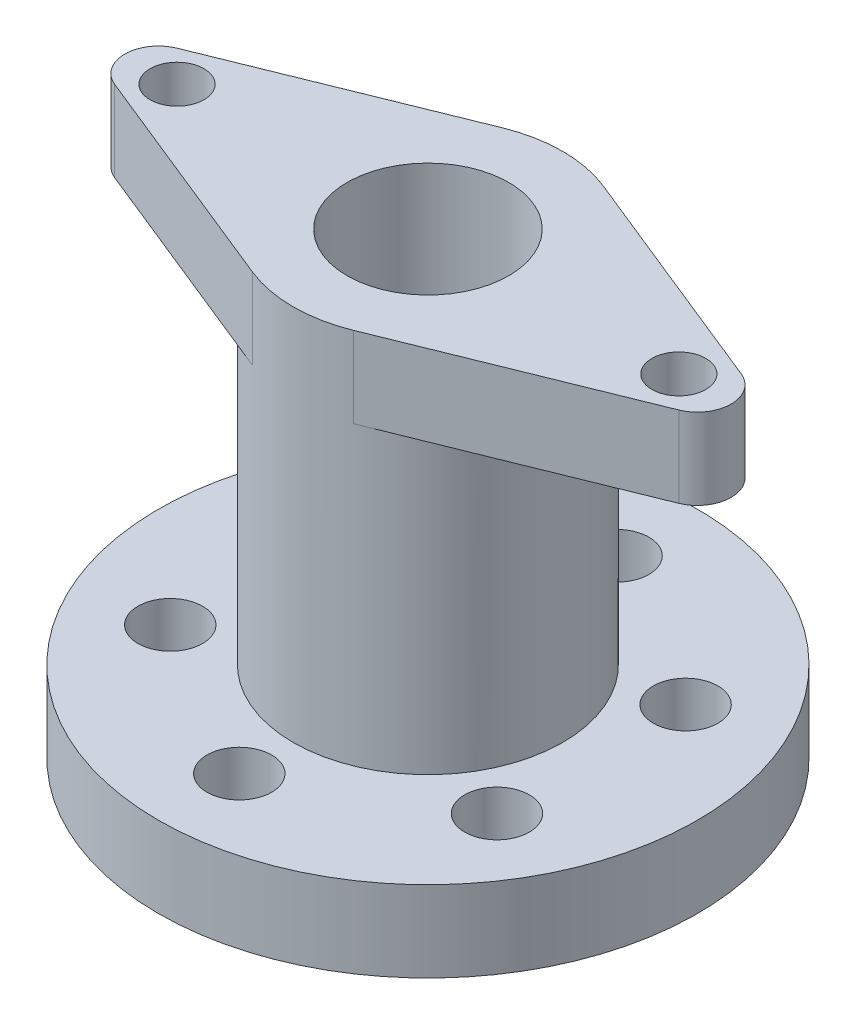
ISO-10303-21;
HEADER;
FILE_DESCRIPTION(('STEP AP214'),'2;1');
FILE_NAME('part.step','',(''),(''),'','','');
FILE_SCHEMA(('AUTOMOTIVE_DESIGN { 1 0 10303 214 1 1 1 1 }'));
ENDSEC;
DATA;
#1=APPLICATION_CONTEXT('core data for automotive mechanical design processes');
#2=APPLICATION_PROTOCOL_DEFINITION('international standard','automotive_design',2000,#1);
#3=PRODUCT_CONTEXT('',#1,'mechanical');
#4=PRODUCT('Part','Part','',(#3));
#5=PRODUCT_RELATED_PRODUCT_CATEGORY('part','',(#4));
#6=PRODUCT_DEFINITION_FORMATION('','',#4);
#7=PRODUCT_DEFINITION_CONTEXT('part definition',#1,'design');
#8=PRODUCT_DEFINITION('design','',#6,#7);
#9=PRODUCT_DEFINITION_SHAPE('','',#8);
#10=(LENGTH_UNIT() NAMED_UNIT(*) SI_UNIT(.MILLI.,.METRE.));
#11=(NAMED_UNIT(*) PLANE_ANGLE_UNIT() SI_UNIT($,.RADIAN.));
#12=(NAMED_UNIT(*) SI_UNIT($,.STERADIAN.) SOLID_ANGLE_UNIT());
#13=UNCERTAINTY_MEASURE_WITH_UNIT(LENGTH_MEASURE(1.E-05),#10,'distance_accuracy_value','');
#14=(GEOMETRIC_REPRESENTATION_CONTEXT(3) GLOBAL_UNCERTAINTY_ASSIGNED_CONTEXT((#13)) GLOBAL_UNIT_ASSIGNED_CONTEXT((#10,
#11,#12)) REPRESENTATION_CONTEXT('',''));
#15=CARTESIAN_POINT('',(0.,0.,0.));
#16=DIRECTION('',(0.,0.,1.));
#17=DIRECTION('',(1.,0.,0.));
#18=AXIS2_PLACEMENT_3D('',#15,#16,#17);
#19=CARTESIAN_POINT('',(-303.108891324531,150.,175.000000000013));
#20=DIRECTION('',(0.,-1.,0.));
#21=DIRECTION('',(0.,0.,-1.));
#22=AXIS2_PLACEMENT_3D('',#19,#20,#21);
#23=CYLINDRICAL_SURFACE('',#22,60.0000000000283);
#24=CARTESIAN_POINT('',(-303.108891324531,150.,175.000000000013));
#25=DIRECTION('',(0.,1.,0.));
#26=DIRECTION('',(0.,0.,1.));
#27=AXIS2_PLACEMENT_3D('',#24,#25,#26);
#28=CIRCLE('',#27,60.0000000000283);
#29=CARTESIAN_POINT('',(-303.108891324531,150.,235.000000000041));
#30=VERTEX_POINT('',#29);
#31=EDGE_CURVE('E208',#30,#30,#28,.T.);
#32=ORIENTED_EDGE('',*,*,#31,.T.);
#33=EDGE_LOOP('',(#32));
#34=FACE_BOUND('',#33,.T.);
#35=CARTESIAN_POINT('',(-303.108891324531,0.,175.000000000013));
#36=DIRECTION('',(0.,1.,0.));
#37=DIRECTION('',(0.,0.,1.));
#38=AXIS2_PLACEMENT_3D('',#35,#36,#37);
#39=CIRCLE('',#38,60.0000000000283);
#40=CARTESIAN_POINT('',(-303.108891324531,0.,235.000000000041));
#41=VERTEX_POINT('',#40);
#42=EDGE_CURVE('E226',#41,#41,#39,.T.);
#43=ORIENTED_EDGE('',*,*,#42,.F.);
#44=EDGE_LOOP('',(#43));
#45=FACE_BOUND('',#44,.T.);
#46=ADVANCED_FACE('F39',(#34,#45),#23,.F.);
#47=CARTESIAN_POINT('',(2.97142069880137E-11,150.,350.));
#48=DIRECTION('',(0.,-1.,0.));
#49=DIRECTION('',(0.,0.,-1.));
#50=AXIS2_PLACEMENT_3D('',#47,#48,#49);
#51=CYLINDRICAL_SURFACE('',#50,60.0000000000308);
#52=CARTESIAN_POINT('',(2.97142069880137E-11,150.,350.));
#53=DIRECTION('',(0.,1.,0.));
#54=DIRECTION('',(0.,0.,1.));
#55=AXIS2_PLACEMENT_3D('',#52,#53,#54);
#56=CIRCLE('',#55,60.0000000000308);
#57=CARTESIAN_POINT('',(2.97142069880137E-11,150.,410.000000000031));
#58=VERTEX_POINT('',#57);
#59=EDGE_CURVE('E205',#58,#58,#56,.T.);
#60=ORIENTED_EDGE('',*,*,#59,.T.);
#61=EDGE_LOOP('',(#60));
#62=FACE_BOUND('',#61,.T.);
#63=CARTESIAN_POINT('',(2.97142069880137E-11,0.,350.));
#64=DIRECTION('',(0.,1.,0.));
#65=DIRECTION('',(0.,0.,1.));
#66=AXIS2_PLACEMENT_3D('',#63,#64,#65);
#67=CIRCLE('',#66,60.0000000000308);
#68=CARTESIAN_POINT('',(2.97142069880137E-11,0.,410.000000000031));
#69=VERTEX_POINT('',#68);
#70=EDGE_CURVE('E224',#69,#69,#67,.T.);
#71=ORIENTED_EDGE('',*,*,#70,.F.);
#72=EDGE_LOOP('',(#71));
#73=FACE_BOUND('',#72,.T.);
#74=ADVANCED_FACE('F254',(#62,#73),#51,.F.);
#75=CARTESIAN_POINT('',(303.108891324576,150.,174.999999999987));
#76=DIRECTION('',(0.,-1.,0.));
#77=DIRECTION('',(0.,0.,-1.));
#78=AXIS2_PLACEMENT_3D('',#75,#76,#77);
#79=CYLINDRICAL_SURFACE('',#78,60.0000000000191);
#80=CARTESIAN_POINT('',(303.108891324576,150.,174.999999999987));
#81=DIRECTION('',(0.,1.,0.));
#82=DIRECTION('',(0.,0.,1.));
#83=AXIS2_PLACEMENT_3D('',#80,#81,#82);
#84=CIRCLE('',#83,60.0000000000191);
#85=CARTESIAN_POINT('',(303.108891324576,150.,235.000000000006));
#86=VERTEX_POINT('',#85);
#87=EDGE_CURVE('E202',#86,#86,#84,.T.);
#88=ORIENTED_EDGE('',*,*,#87,.T.);
#89=EDGE_LOOP('',(#88));
#90=FACE_BOUND('',#89,.T.);
#91=CARTESIAN_POINT('',(303.108891324576,0.,174.999999999987));
#92=DIRECTION('',(0.,1.,0.));
#93=DIRECTION('',(0.,0.,1.));
#94=AXIS2_PLACEMENT_3D('',#91,#92,#93);
#95=CIRCLE('',#94,60.0000000000191);
#96=CARTESIAN_POINT('',(303.108891324576,0.,235.000000000006));
#97=VERTEX_POINT('',#96);
#98=EDGE_CURVE('E221',#97,#97,#95,.T.);
#99=ORIENTED_EDGE('',*,*,#98,.F.);
#100=EDGE_LOOP('',(#99));
#101=FACE_BOUND('',#100,.T.);
#102=ADVANCED_FACE('F260',(#90,#101),#79,.F.);
#103=CARTESIAN_POINT('',(303.108891324561,150.,-175.000000000013));
#104=DIRECTION('',(0.,-1.,0.));
#105=DIRECTION('',(0.,0.,-1.));
#106=AXIS2_PLACEMENT_3D('',#103,#104,#105);
#107=CYLINDRICAL_SURFACE('',#106,60.0000000000042);
#108=CARTESIAN_POINT('',(303.108891324561,150.,-175.000000000013));
#109=DIRECTION('',(0.,1.,0.));
#110=DIRECTION('',(0.,0.,1.));
#111=AXIS2_PLACEMENT_3D('',#108,#109,#110);
#112=CIRCLE('',#111,60.0000000000042);
#113=CARTESIAN_POINT('',(303.108891324561,150.,-115.000000000009));
#114=VERTEX_POINT('',#113);
#115=EDGE_CURVE('E199',#114,#114,#112,.T.);
#116=ORIENTED_EDGE('',*,*,#115,.T.);
#117=EDGE_LOOP('',(#116));
#118=FACE_BOUND('',#117,.T.);
#119=CARTESIAN_POINT('',(303.108891324561,0.,-175.000000000013));
#120=DIRECTION('',(0.,1.,0.));
#121=DIRECTION('',(0.,0.,1.));
#122=AXIS2_PLACEMENT_3D('',#119,#120,#121);
#123=CIRCLE('',#122,60.0000000000042);
#124=CARTESIAN_POINT('',(303.108891324561,0.,-115.000000000009));
#125=VERTEX_POINT('',#124);
#126=EDGE_CURVE('E218',#125,#125,#123,.T.);
#127=ORIENTED_EDGE('',*,*,#126,.F.);
#128=EDGE_LOOP('',(#127));
#129=FACE_BOUND('',#128,.T.);
#130=ADVANCED_FACE('F267',(#118,#129),#107,.F.);
#131=CARTESIAN_POINT('',(0.,150.,-350.));
#132=DIRECTION('',(0.,-1.,0.));
#133=DIRECTION('',(0.,0.,-1.));
#134=AXIS2_PLACEMENT_3D('',#131,#132,#133);
#135=CYLINDRICAL_SURFACE('',#134,60.);
#136=CARTESIAN_POINT('',(0.,150.,-350.));
#137=DIRECTION('',(0.,1.,0.));
#138=DIRECTION('',(0.,0.,1.));
#139=AXIS2_PLACEMENT_3D('',#136,#137,#138);
#140=CIRCLE('',#139,60.);
#141=CARTESIAN_POINT('',(0.,150.,-290.));
#142=VERTEX_POINT('',#141);
#143=EDGE_CURVE('E196',#142,#142,#140,.T.);
#144=ORIENTED_EDGE('',*,*,#143,.T.);
#145=EDGE_LOOP('',(#144));
#146=FACE_BOUND('',#145,.T.);
#147=CARTESIAN_POINT('',(0.,0.,-350.));
#148=DIRECTION('',(0.,1.,0.));
#149=DIRECTION('',(0.,0.,1.));
#150=AXIS2_PLACEMENT_3D('',#147,#148,#149);
#151=CIRCLE('',#150,60.);
#152=CARTESIAN_POINT('',(0.,0.,-290.));
#153=VERTEX_POINT('',#152);
#154=EDGE_CURVE('E215',#153,#153,#151,.T.);
#155=ORIENTED_EDGE('',*,*,#154,.F.);
#156=EDGE_LOOP('',(#155));
#157=FACE_BOUND('',#156,.T.);
#158=ADVANCED_FACE('F270',(#146,#157),#135,.F.);
#159=CARTESIAN_POINT('',(-303.108891324546,150.,-174.999999999987));
#160=DIRECTION('',(0.,-1.,0.));
#161=DIRECTION('',(0.,0.,-1.));
#162=AXIS2_PLACEMENT_3D('',#159,#160,#161);
#163=CYLINDRICAL_SURFACE('',#162,60.000000000015);
#164=CARTESIAN_POINT('',(-303.108891324546,150.,-174.999999999987));
#165=DIRECTION('',(0.,1.,0.));
#166=DIRECTION('',(0.,0.,1.));
#167=AXIS2_PLACEMENT_3D('',#164,#165,#166);
#168=CIRCLE('',#167,60.000000000015);
#169=CARTESIAN_POINT('',(-303.108891324546,150.,-114.999999999972));
#170=VERTEX_POINT('',#169);
#171=EDGE_CURVE('E193',#170,#170,#168,.T.);
#172=ORIENTED_EDGE('',*,*,#171,.T.);
#173=EDGE_LOOP('',(#172));
#174=FACE_BOUND('',#173,.T.);
#175=CARTESIAN_POINT('',(-303.108891324546,0.,-174.999999999987));
#176=DIRECTION('',(0.,1.,0.));
#177=DIRECTION('',(0.,0.,1.));
#178=AXIS2_PLACEMENT_3D('',#175,#176,#177);
#179=CIRCLE('',#178,60.000000000015);
#180=CARTESIAN_POINT('',(-303.108891324546,0.,-114.999999999972));
#181=VERTEX_POINT('',#180);
#182=EDGE_CURVE('E192',#181,#181,#179,.T.);
#183=ORIENTED_EDGE('',*,*,#182,.F.);
#184=EDGE_LOOP('',(#183));
#185=FACE_BOUND('',#184,.T.);
#186=ADVANCED_FACE('F41',(#174,#185),#163,.F.);
#187=CARTESIAN_POINT('',(0.,150.,0.));
#188=DIRECTION('',(0.,-1.,0.));
#189=DIRECTION('',(0.,0.,-1.));
#190=AXIS2_PLACEMENT_3D('',#187,#188,#189);
#191=CYLINDRICAL_SURFACE('',#190,500.);
#192=CARTESIAN_POINT('',(0.,150.,0.));
#193=DIRECTION('',(0.,1.,0.));
#194=DIRECTION('',(0.,0.,1.));
#195=AXIS2_PLACEMENT_3D('',#192,#193,#194);
#196=CIRCLE('',#195,500.);
#197=CARTESIAN_POINT('',(0.,150.,500.));
#198=VERTEX_POINT('',#197);
#199=EDGE_CURVE('E48',#198,#198,#196,.T.);
#200=ORIENTED_EDGE('',*,*,#199,.F.);
#201=EDGE_LOOP('',(#200));
#202=FACE_BOUND('',#201,.T.);
#203=CARTESIAN_POINT('',(0.,0.,0.));
#204=DIRECTION('',(0.,1.,0.));
#205=DIRECTION('',(0.,0.,1.));
#206=AXIS2_PLACEMENT_3D('',#203,#204,#205);
#207=CIRCLE('',#206,500.);
#208=CARTESIAN_POINT('',(0.,0.,500.));
#209=VERTEX_POINT('',#208);
#210=EDGE_CURVE('E43',#209,#209,#207,.T.);
#211=ORIENTED_EDGE('',*,*,#210,.T.);
#212=EDGE_LOOP('',(#211));
#213=FACE_BOUND('',#212,.T.);
#214=ADVANCED_FACE('F233',(#202,#213),#191,.T.);
#215=CARTESIAN_POINT('',(0.,150.,0.));
#216=DIRECTION('',(0.,1.,0.));
#217=DIRECTION('',(0.,0.,1.));
#218=AXIS2_PLACEMENT_3D('',#215,#216,#217);
#219=PLANE('',#218);
#220=CARTESIAN_POINT('',(0.,150.,0.));
#221=DIRECTION('',(0.,1.,0.));
#222=DIRECTION('',(0.,0.,1.));
#223=AXIS2_PLACEMENT_3D('',#220,#221,#222);
#224=CIRCLE('',#223,250.);
#225=CARTESIAN_POINT('',(0.,150.,250.));
#226=VERTEX_POINT('',#225);
#227=EDGE_CURVE('E188',#226,#226,#224,.F.);
#228=ORIENTED_EDGE('',*,*,#227,.T.);
#229=EDGE_LOOP('',(#228));
#230=FACE_BOUND('',#229,.T.);
#231=ORIENTED_EDGE('',*,*,#171,.F.);
#232=EDGE_LOOP('',(#231));
#233=FACE_BOUND('',#232,.T.);
#234=ORIENTED_EDGE('',*,*,#143,.F.);
#235=EDGE_LOOP('',(#234));
#236=FACE_BOUND('',#235,.T.);
#237=ORIENTED_EDGE('',*,*,#115,.F.);
#238=EDGE_LOOP('',(#237));
#239=FACE_BOUND('',#238,.T.);
#240=ORIENTED_EDGE('',*,*,#87,.F.);
#241=EDGE_LOOP('',(#240));
#242=FACE_BOUND('',#241,.T.);
#243=ORIENTED_EDGE('',*,*,#59,.F.);
#244=EDGE_LOOP('',(#243));
#245=FACE_BOUND('',#244,.T.);
#246=ORIENTED_EDGE('',*,*,#31,.F.);
#247=EDGE_LOOP('',(#246));
#248=FACE_BOUND('',#247,.T.);
#249=ORIENTED_EDGE('',*,*,#199,.T.);
#250=EDGE_LOOP('',(#249));
#251=FACE_BOUND('',#250,.T.);
#252=ADVANCED_FACE('F238',(#230,#233,#236,#239,#242,#245,#248,#251),#219,.T.);
#253=CARTESIAN_POINT('',(0.,0.,0.));
#254=DIRECTION('',(0.,1.,0.));
#255=DIRECTION('',(0.,0.,1.));
#256=AXIS2_PLACEMENT_3D('',#253,#254,#255);
#257=PLANE('',#256);
#258=ORIENTED_EDGE('',*,*,#182,.T.);
#259=EDGE_LOOP('',(#258));
#260=FACE_BOUND('',#259,.T.);
#261=ORIENTED_EDGE('',*,*,#154,.T.);
#262=EDGE_LOOP('',(#261));
#263=FACE_BOUND('',#262,.T.);
#264=ORIENTED_EDGE('',*,*,#126,.T.);
#265=EDGE_LOOP('',(#264));
#266=FACE_BOUND('',#265,.T.);
#267=ORIENTED_EDGE('',*,*,#98,.T.);
#268=EDGE_LOOP('',(#267));
#269=FACE_BOUND('',#268,.T.);
#270=ORIENTED_EDGE('',*,*,#70,.T.);
#271=EDGE_LOOP('',(#270));
#272=FACE_BOUND('',#271,.T.);
#273=ORIENTED_EDGE('',*,*,#42,.T.);
#274=EDGE_LOOP('',(#273));
#275=FACE_BOUND('',#274,.T.);
#276=ORIENTED_EDGE('',*,*,#210,.F.);
#277=EDGE_LOOP('',(#276));
#278=FACE_BOUND('',#277,.T.);
#279=ADVANCED_FACE('F235',(#260,#263,#266,#269,#272,#275,#278),#257,.F.);
#280=CARTESIAN_POINT('',(0.,700.,0.));
#281=DIRECTION('',(0.,-1.,0.));
#282=DIRECTION('',(0.,0.,-1.));
#283=AXIS2_PLACEMENT_3D('',#280,#281,#282);
#284=CYLINDRICAL_SURFACE('',#283,250.);
#285=ORIENTED_EDGE('',*,*,#227,.F.);
#286=EDGE_LOOP('',(#285));
#287=FACE_BOUND('',#286,.T.);
#288=CARTESIAN_POINT('',(0.,700.,0.));
#289=DIRECTION('',(0.,1.,0.));
#290=DIRECTION('',(0.,0.,1.));
#291=AXIS2_PLACEMENT_3D('',#288,#289,#290);
#292=CIRCLE('',#291,250.);
#293=CARTESIAN_POINT('',(93.7500000000001,700.,231.75620272174));
#294=VERTEX_POINT('',#293);
#295=CARTESIAN_POINT('',(93.7500000000001,700.,-231.75620272174));
#296=VERTEX_POINT('',#295);
#297=EDGE_CURVE('E187',#294,#296,#292,.T.);
#298=ORIENTED_EDGE('',*,*,#297,.F.);
#299=DIRECTION('',(0.,-1.,0.));
#300=VECTOR('',#299,1.);
#301=CARTESIAN_POINT('',(93.7500000000001,850.,231.75620272174));
#302=LINE('',#301,#300);
#303=CARTESIAN_POINT('',(93.7500000000001,850.,231.75620272174));
#304=VERTEX_POINT('',#303);
#305=EDGE_CURVE('E181',#304,#294,#302,.T.);
#306=ORIENTED_EDGE('',*,*,#305,.F.);
#307=CARTESIAN_POINT('',(0.,850.,0.));
#308=DIRECTION('',(0.,1.,0.));
#309=DIRECTION('',(0.,0.,1.));
#310=AXIS2_PLACEMENT_3D('',#307,#308,#309);
#311=CIRCLE('',#310,250.);
#312=CARTESIAN_POINT('',(-93.7500000000001,850.,231.75620272174));
#313=VERTEX_POINT('',#312);
#314=EDGE_CURVE('E136',#313,#304,#311,.T.);
#315=ORIENTED_EDGE('',*,*,#314,.F.);
#316=DIRECTION('',(0.,-1.,0.));
#317=VECTOR('',#316,1.);
#318=CARTESIAN_POINT('',(-93.7500000000001,850.,231.75620272174));
#319=LINE('',#318,#317);
#320=CARTESIAN_POINT('',(-93.7500000000001,700.,231.75620272174));
#321=VERTEX_POINT('',#320);
#322=EDGE_CURVE('E184',#313,#321,#319,.T.);
#323=ORIENTED_EDGE('',*,*,#322,.T.);
#324=CARTESIAN_POINT('',(-93.7500000000001,700.,-231.75620272174));
#325=VERTEX_POINT('',#324);
#326=EDGE_CURVE('E56',#325,#321,#292,.T.);
#327=ORIENTED_EDGE('',*,*,#326,.F.);
#328=DIRECTION('',(0.,-1.,0.));
#329=VECTOR('',#328,1.);
#330=CARTESIAN_POINT('',(-93.7500000000001,850.,-231.756202721739));
#331=LINE('',#330,#329);
#332=CARTESIAN_POINT('',(-93.7500000000001,850.,-231.756202721739));
#333=VERTEX_POINT('',#332);
#334=EDGE_CURVE('E152',#333,#325,#331,.T.);
#335=ORIENTED_EDGE('',*,*,#334,.F.);
#336=CARTESIAN_POINT('',(93.7500000000001,850.,-231.756202721739));
#337=VERTEX_POINT('',#336);
#338=EDGE_CURVE('E128',#337,#333,#311,.T.);
#339=ORIENTED_EDGE('',*,*,#338,.F.);
#340=DIRECTION('',(0.,-1.,0.));
#341=VECTOR('',#340,1.);
#342=CARTESIAN_POINT('',(93.7500000000001,850.,-231.756202721739));
#343=LINE('',#342,#341);
#344=EDGE_CURVE('E174',#337,#296,#343,.T.);
#345=ORIENTED_EDGE('',*,*,#344,.T.);
#346=EDGE_LOOP('',(#298,#306,#315,#323,#327,#335,#339,#345));
#347=FACE_BOUND('',#346,.T.);
#348=ADVANCED_FACE('F237',(#287,#347),#284,.T.);
#349=CARTESIAN_POINT('',(0.,700.,0.));
#350=DIRECTION('',(0.,1.,0.));
#351=DIRECTION('',(0.,0.,1.));
#352=AXIS2_PLACEMENT_3D('',#349,#350,#351);
#353=PLANE('',#352);
#354=CARTESIAN_POINT('',(465.559791402256,700.,0.));
#355=DIRECTION('',(0.,1.,0.));
#356=DIRECTION('',(0.,0.,1.));
#357=AXIS2_PLACEMENT_3D('',#354,#355,#356);
#358=CIRCLE('',#357,50.);
#359=CARTESIAN_POINT('',(465.559791402256,700.,50.));
#360=VERTEX_POINT('',#359);
#361=EDGE_CURVE('E132',#360,#360,#358,.T.);
#362=ORIENTED_EDGE('',*,*,#361,.T.);
#363=EDGE_LOOP('',(#362));
#364=FACE_BOUND('',#363,.T.);
#365=DIRECTION('',(-0.927024810886958,0.,0.375));
#366=VECTOR('',#365,1.);
#367=CARTESIAN_POINT('',(93.7500000000001,700.,231.75620272174));
#368=LINE('',#367,#366);
#369=CARTESIAN_POINT('',(523.4375,700.,57.939050680435));
#370=VERTEX_POINT('',#369);
#371=EDGE_CURVE('E162',#370,#294,#368,.T.);
#372=ORIENTED_EDGE('',*,*,#371,.T.);
#373=ORIENTED_EDGE('',*,*,#297,.T.);
#374=DIRECTION('',(-0.927024810886958,0.,-0.375));
#375=VECTOR('',#374,1.);
#376=CARTESIAN_POINT('',(93.7500000000001,700.,-231.756202721739));
#377=LINE('',#376,#375);
#378=CARTESIAN_POINT('',(523.4375,700.,-57.9390506804347));
#379=VERTEX_POINT('',#378);
#380=EDGE_CURVE('E168',#379,#296,#377,.T.);
#381=ORIENTED_EDGE('',*,*,#380,.F.);
#382=CARTESIAN_POINT('',(500.,700.,0.));
#383=DIRECTION('',(0.,1.,0.));
#384=DIRECTION('',(0.,0.,1.));
#385=AXIS2_PLACEMENT_3D('',#382,#383,#384);
#386=CIRCLE('',#385,62.5);
#387=EDGE_CURVE('E165',#379,#370,#386,.F.);
#388=ORIENTED_EDGE('',*,*,#387,.T.);
#389=EDGE_LOOP('',(#372,#373,#381,#388));
#390=FACE_BOUND('',#389,.T.);
#391=ADVANCED_FACE('F245',(#364,#390),#353,.F.);
#392=CARTESIAN_POINT('',(-465.559791402256,700.,0.));
#393=DIRECTION('',(0.,1.,0.));
#394=DIRECTION('',(0.,0.,1.));
#395=AXIS2_PLACEMENT_3D('',#392,#393,#394);
#396=CIRCLE('',#395,50.);
#397=CARTESIAN_POINT('',(-465.559791402256,700.,50.));
#398=VERTEX_POINT('',#397);
#399=EDGE_CURVE('E153',#398,#398,#396,.T.);
#400=ORIENTED_EDGE('',*,*,#399,.T.);
#401=EDGE_LOOP('',(#400));
#402=FACE_BOUND('',#401,.T.);
#403=DIRECTION('',(0.927024810886958,0.,-0.375));
#404=VECTOR('',#403,1.);
#405=CARTESIAN_POINT('',(-93.7500000000001,700.,-231.756202721739));
#406=LINE('',#405,#404);
#407=CARTESIAN_POINT('',(-523.4375,700.,-57.9390506804347));
#408=VERTEX_POINT('',#407);
#409=EDGE_CURVE('E110',#408,#325,#406,.T.);
#410=ORIENTED_EDGE('',*,*,#409,.T.);
#411=ORIENTED_EDGE('',*,*,#326,.T.);
#412=DIRECTION('',(0.927024810886958,0.,0.375));
#413=VECTOR('',#412,1.);
#414=CARTESIAN_POINT('',(-93.7500000000001,700.,231.75620272174));
#415=LINE('',#414,#413);
#416=CARTESIAN_POINT('',(-523.4375,700.,57.939050680435));
#417=VERTEX_POINT('',#416);
#418=EDGE_CURVE('E159',#417,#321,#415,.T.);
#419=ORIENTED_EDGE('',*,*,#418,.F.);
#420=CARTESIAN_POINT('',(-500.,700.,0.));
#421=DIRECTION('',(0.,1.,0.));
#422=DIRECTION('',(0.,0.,1.));
#423=AXIS2_PLACEMENT_3D('',#420,#421,#422);
#424=CIRCLE('',#423,62.5);
#425=EDGE_CURVE('E157',#408,#417,#424,.T.);
#426=ORIENTED_EDGE('',*,*,#425,.F.);
#427=EDGE_LOOP('',(#410,#411,#419,#426));
#428=FACE_BOUND('',#427,.T.);
#429=ADVANCED_FACE('F347',(#402,#428),#353,.F.);
#430=CARTESIAN_POINT('',(-93.7500000000001,850.,-231.756202721739));
#431=DIRECTION('',(-0.375,0.,-0.927024810886958));
#432=DIRECTION('',(-0.927024810886958,0.,0.375));
#433=AXIS2_PLACEMENT_3D('',#430,#431,#432);
#434=PLANE('',#433);
#435=ORIENTED_EDGE('',*,*,#409,.F.);
#436=DIRECTION('',(0.,-1.,0.));
#437=VECTOR('',#436,1.);
#438=CARTESIAN_POINT('',(-523.4375,850.,-57.9390506804347));
#439=LINE('',#438,#437);
#440=CARTESIAN_POINT('',(-523.4375,850.,-57.9390506804347));
#441=VERTEX_POINT('',#440);
#442=EDGE_CURVE('E105',#441,#408,#439,.T.);
#443=ORIENTED_EDGE('',*,*,#442,.F.);
#444=DIRECTION('',(0.927024810886958,0.,-0.375));
#445=VECTOR('',#444,1.);
#446=CARTESIAN_POINT('',(-93.7500000000001,850.,-231.756202721739));
#447=LINE('',#446,#445);
#448=EDGE_CURVE('E109',#441,#333,#447,.T.);
#449=ORIENTED_EDGE('',*,*,#448,.T.);
#450=ORIENTED_EDGE('',*,*,#334,.T.);
#451=EDGE_LOOP('',(#435,#443,#449,#450));
#452=FACE_BOUND('',#451,.T.);
#453=ADVANCED_FACE('F107',(#452),#434,.T.);
#454=CARTESIAN_POINT('',(-500.,850.,0.));
#455=DIRECTION('',(0.,-1.,0.));
#456=DIRECTION('',(0.,0.,-1.));
#457=AXIS2_PLACEMENT_3D('',#454,#455,#456);
#458=CYLINDRICAL_SURFACE('',#457,62.5);
#459=ORIENTED_EDGE('',*,*,#425,.T.);
#460=DIRECTION('',(0.,-1.,0.));
#461=VECTOR('',#460,1.);
#462=CARTESIAN_POINT('',(-523.4375,850.,57.939050680435));
#463=LINE('',#462,#461);
#464=CARTESIAN_POINT('',(-523.4375,850.,57.939050680435));
#465=VERTEX_POINT('',#464);
#466=EDGE_CURVE('E114',#465,#417,#463,.T.);
#467=ORIENTED_EDGE('',*,*,#466,.F.);
#468=CARTESIAN_POINT('',(-500.,850.,0.));
#469=DIRECTION('',(0.,1.,0.));
#470=DIRECTION('',(0.,0.,1.));
#471=AXIS2_PLACEMENT_3D('',#468,#469,#470);
#472=CIRCLE('',#471,62.5);
#473=EDGE_CURVE('E118',#441,#465,#472,.T.);
#474=ORIENTED_EDGE('',*,*,#473,.F.);
#475=ORIENTED_EDGE('',*,*,#442,.T.);
#476=EDGE_LOOP('',(#459,#467,#474,#475));
#477=FACE_BOUND('',#476,.T.);
#478=ADVANCED_FACE('F119',(#477),#458,.T.);
#479=CARTESIAN_POINT('',(-93.7500000000001,850.,231.75620272174));
#480=DIRECTION('',(0.375,0.,-0.927024810886958));
#481=DIRECTION('',(-0.927024810886958,0.,-0.375));
#482=AXIS2_PLACEMENT_3D('',#479,#480,#481);
#483=PLANE('',#482);
#484=ORIENTED_EDGE('',*,*,#418,.T.);
#485=ORIENTED_EDGE('',*,*,#322,.F.);
#486=DIRECTION('',(0.927024810886958,0.,0.375));
#487=VECTOR('',#486,1.);
#488=CARTESIAN_POINT('',(-93.7500000000001,850.,231.75620272174));
#489=LINE('',#488,#487);
#490=EDGE_CURVE('E123',#465,#313,#489,.T.);
#491=ORIENTED_EDGE('',*,*,#490,.F.);
#492=ORIENTED_EDGE('',*,*,#466,.T.);
#493=EDGE_LOOP('',(#484,#485,#491,#492));
#494=FACE_BOUND('',#493,.T.);
#495=ADVANCED_FACE('F376',(#494),#483,.F.);
#496=CARTESIAN_POINT('',(93.7500000000001,850.,231.75620272174));
#497=DIRECTION('',(0.375,0.,0.927024810886958));
#498=DIRECTION('',(0.927024810886958,0.,-0.375));
#499=AXIS2_PLACEMENT_3D('',#496,#497,#498);
#500=PLANE('',#499);
#501=ORIENTED_EDGE('',*,*,#371,.F.);
#502=DIRECTION('',(0.,-1.,0.));
#503=VECTOR('',#502,1.);
#504=CARTESIAN_POINT('',(523.4375,850.,57.939050680435));
#505=LINE('',#504,#503);
#506=CARTESIAN_POINT('',(523.4375,850.,57.939050680435));
#507=VERTEX_POINT('',#506);
#508=EDGE_CURVE('E179',#507,#370,#505,.T.);
#509=ORIENTED_EDGE('',*,*,#508,.F.);
#510=DIRECTION('',(-0.927024810886958,0.,0.375));
#511=VECTOR('',#510,1.);
#512=CARTESIAN_POINT('',(93.7500000000001,850.,231.75620272174));
#513=LINE('',#512,#511);
#514=EDGE_CURVE('E138',#507,#304,#513,.T.);
#515=ORIENTED_EDGE('',*,*,#514,.T.);
#516=ORIENTED_EDGE('',*,*,#305,.T.);
#517=EDGE_LOOP('',(#501,#509,#515,#516));
#518=FACE_BOUND('',#517,.T.);
#519=ADVANCED_FACE('F385',(#518),#500,.T.);
#520=CARTESIAN_POINT('',(500.,850.,0.));
#521=DIRECTION('',(0.,-1.,0.));
#522=DIRECTION('',(0.,0.,-1.));
#523=AXIS2_PLACEMENT_3D('',#520,#521,#522);
#524=CYLINDRICAL_SURFACE('',#523,62.5);
#525=ORIENTED_EDGE('',*,*,#387,.F.);
#526=DIRECTION('',(0.,-1.,0.));
#527=VECTOR('',#526,1.);
#528=CARTESIAN_POINT('',(523.4375,850.,-57.9390506804347));
#529=LINE('',#528,#527);
#530=CARTESIAN_POINT('',(523.4375,850.,-57.9390506804347));
#531=VERTEX_POINT('',#530);
#532=EDGE_CURVE('E177',#531,#379,#529,.T.);
#533=ORIENTED_EDGE('',*,*,#532,.F.);
#534=CARTESIAN_POINT('',(500.,850.,0.));
#535=DIRECTION('',(0.,1.,0.));
#536=DIRECTION('',(0.,0.,1.));
#537=AXIS2_PLACEMENT_3D('',#534,#535,#536);
#538=CIRCLE('',#537,62.5);
#539=EDGE_CURVE('E141',#531,#507,#538,.F.);
#540=ORIENTED_EDGE('',*,*,#539,.T.);
#541=ORIENTED_EDGE('',*,*,#508,.T.);
#542=EDGE_LOOP('',(#525,#533,#540,#541));
#543=FACE_BOUND('',#542,.T.);
#544=ADVANCED_FACE('F395',(#543),#524,.T.);
#545=CARTESIAN_POINT('',(93.7500000000001,850.,-231.756202721739));
#546=DIRECTION('',(-0.375,0.,0.927024810886958));
#547=DIRECTION('',(0.927024810886958,0.,0.375));
#548=AXIS2_PLACEMENT_3D('',#545,#546,#547);
#549=PLANE('',#548);
#550=ORIENTED_EDGE('',*,*,#380,.T.);
#551=ORIENTED_EDGE('',*,*,#344,.F.);
#552=DIRECTION('',(-0.927024810886958,0.,-0.375));
#553=VECTOR('',#552,1.);
#554=CARTESIAN_POINT('',(93.7500000000001,850.,-231.756202721739));
#555=LINE('',#554,#553);
#556=EDGE_CURVE('E144',#531,#337,#555,.T.);
#557=ORIENTED_EDGE('',*,*,#556,.F.);
#558=ORIENTED_EDGE('',*,*,#532,.T.);
#559=EDGE_LOOP('',(#550,#551,#557,#558));
#560=FACE_BOUND('',#559,.T.);
#561=ADVANCED_FACE('F405',(#560),#549,.F.);
#562=CARTESIAN_POINT('',(-465.559791402256,850.,0.));
#563=DIRECTION('',(0.,-1.,0.));
#564=DIRECTION('',(0.,0.,-1.));
#565=AXIS2_PLACEMENT_3D('',#562,#563,#564);
#566=CYLINDRICAL_SURFACE('',#565,50.);
#567=CARTESIAN_POINT('',(-465.559791402256,850.,0.));
#568=DIRECTION('',(0.,1.,0.));
#569=DIRECTION('',(0.,0.,1.));
#570=AXIS2_PLACEMENT_3D('',#567,#568,#569);
#571=CIRCLE('',#570,50.);
#572=CARTESIAN_POINT('',(-465.559791402256,850.,50.));
#573=VERTEX_POINT('',#572);
#574=EDGE_CURVE('E129',#573,#573,#571,.T.);
#575=ORIENTED_EDGE('',*,*,#574,.T.);
#576=EDGE_LOOP('',(#575));
#577=FACE_BOUND('',#576,.T.);
#578=ORIENTED_EDGE('',*,*,#399,.F.);
#579=EDGE_LOOP('',(#578));
#580=FACE_BOUND('',#579,.T.);
#581=ADVANCED_FACE('F415',(#577,#580),#566,.F.);
#582=CARTESIAN_POINT('',(465.559791402256,850.,0.));
#583=DIRECTION('',(0.,-1.,0.));
#584=DIRECTION('',(0.,0.,-1.));
#585=AXIS2_PLACEMENT_3D('',#582,#583,#584);
#586=CYLINDRICAL_SURFACE('',#585,50.);
#587=CARTESIAN_POINT('',(465.559791402256,850.,0.));
#588=DIRECTION('',(0.,1.,0.));
#589=DIRECTION('',(0.,0.,1.));
#590=AXIS2_PLACEMENT_3D('',#587,#588,#589);
#591=CIRCLE('',#590,50.);
#592=CARTESIAN_POINT('',(465.559791402256,850.,50.));
#593=VERTEX_POINT('',#592);
#594=EDGE_CURVE('E149',#593,#593,#591,.T.);
#595=ORIENTED_EDGE('',*,*,#594,.T.);
#596=EDGE_LOOP('',(#595));
#597=FACE_BOUND('',#596,.T.);
#598=ORIENTED_EDGE('',*,*,#361,.F.);
#599=EDGE_LOOP('',(#598));
#600=FACE_BOUND('',#599,.T.);
#601=ADVANCED_FACE('F425',(#597,#600),#586,.F.);
#602=CARTESIAN_POINT('',(0.,850.,0.));
#603=DIRECTION('',(0.,1.,0.));
#604=DIRECTION('',(0.,0.,1.));
#605=AXIS2_PLACEMENT_3D('',#602,#603,#604);
#606=PLANE('',#605);
#607=ORIENTED_EDGE('',*,*,#574,.F.);
#608=EDGE_LOOP('',(#607));
#609=FACE_BOUND('',#608,.T.);
#610=ORIENTED_EDGE('',*,*,#448,.F.);
#611=ORIENTED_EDGE('',*,*,#473,.T.);
#612=ORIENTED_EDGE('',*,*,#490,.T.);
#613=ORIENTED_EDGE('',*,*,#314,.T.);
#614=ORIENTED_EDGE('',*,*,#514,.F.);
#615=ORIENTED_EDGE('',*,*,#539,.F.);
#616=ORIENTED_EDGE('',*,*,#556,.T.);
#617=ORIENTED_EDGE('',*,*,#338,.T.);
#618=EDGE_LOOP('',(#610,#611,#612,#613,#614,#615,#616,#617));
#619=FACE_BOUND('',#618,.T.);
#620=CARTESIAN_POINT('',(0.,850.,0.));
#621=DIRECTION('',(0.,1.,0.));
#622=DIRECTION('',(0.,0.,1.));
#623=AXIS2_PLACEMENT_3D('',#620,#621,#622);
#624=CIRCLE('',#623,150.);
#625=CARTESIAN_POINT('',(0.,850.,150.));
#626=VERTEX_POINT('',#625);
#627=EDGE_CURVE('E146',#626,#626,#624,.F.);
#628=ORIENTED_EDGE('',*,*,#627,.T.);
#629=EDGE_LOOP('',(#628));
#630=FACE_BOUND('',#629,.T.);
#631=ORIENTED_EDGE('',*,*,#594,.F.);
#632=EDGE_LOOP('',(#631));
#633=FACE_BOUND('',#632,.T.);
#634=ADVANCED_FACE('F125',(#609,#619,#630,#633),#606,.T.);
#635=CARTESIAN_POINT('',(0.,150.,0.));
#636=DIRECTION('',(0.,1.,0.));
#637=DIRECTION('',(0.,0.,1.));
#638=AXIS2_PLACEMENT_3D('',#635,#636,#637);
#639=CIRCLE('',#638,150.);
#640=CARTESIAN_POINT('',(0.,150.,150.));
#641=VERTEX_POINT('',#640);
#642=EDGE_CURVE('E11',#641,#641,#639,.F.);
#643=ORIENTED_EDGE('',*,*,#642,.F.);
#644=EDGE_LOOP('',(#643));
#645=FACE_BOUND('',#644,.T.);
#646=ADVANCED_FACE('F250',(#645),#219,.T.);
#647=CARTESIAN_POINT('',(0.,700.,0.));
#648=DIRECTION('',(0.,-1.,0.));
#649=DIRECTION('',(0.,0.,-1.));
#650=AXIS2_PLACEMENT_3D('',#647,#648,#649);
#651=CYLINDRICAL_SURFACE('',#650,150.);
#652=ORIENTED_EDGE('',*,*,#642,.T.);
#653=EDGE_LOOP('',(#652));
#654=FACE_BOUND('',#653,.T.);
#655=ORIENTED_EDGE('',*,*,#627,.F.);
#656=EDGE_LOOP('',(#655));
#657=FACE_BOUND('',#656,.T.);
#658=ADVANCED_FACE('F327',(#654,#657),#651,.F.);
#659=CLOSED_SHELL('',(#46,#74,#102,#130,#158,#186,#214,#252,#279,#348,#391,#429,#453,#478,#495,
#519,#544,#561,#581,#601,#634,#646,#658));
#660=MANIFOLD_SOLID_BREP('B2',#659);
#661=ADVANCED_BREP_SHAPE_REPRESENTATION('',(#18,#660),#14);
#662=SHAPE_DEFINITION_REPRESENTATION(#9,#661);
ENDSEC;
END-ISO-10303-21;
